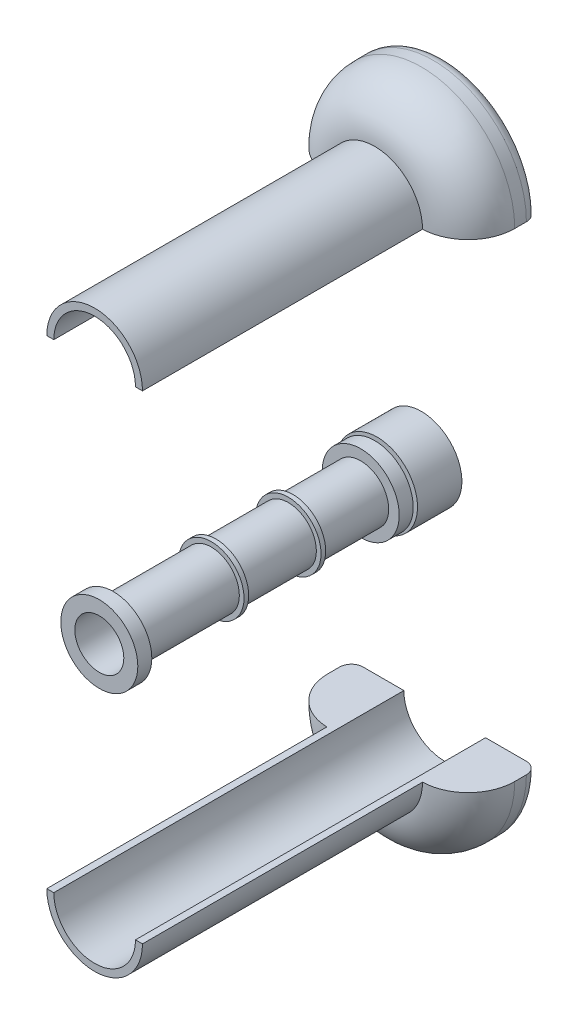
ISO-10303-21;
HEADER;
FILE_DESCRIPTION(('STEP AP214'),'2;1');
FILE_NAME('part.step','',(''),(''),'','','');
FILE_SCHEMA(('AUTOMOTIVE_DESIGN { 1 0 10303 214 1 1 1 1 }'));
ENDSEC;
DATA;
#1=APPLICATION_CONTEXT('core data for automotive mechanical design processes');
#2=APPLICATION_PROTOCOL_DEFINITION('international standard','automotive_design',2000,#1);
#3=PRODUCT_CONTEXT('',#1,'mechanical');
#4=PRODUCT('Part','Part','',(#3));
#5=PRODUCT_RELATED_PRODUCT_CATEGORY('part','',(#4));
#6=PRODUCT_DEFINITION_FORMATION('','',#4);
#7=PRODUCT_DEFINITION_CONTEXT('part definition',#1,'design');
#8=PRODUCT_DEFINITION('design','',#6,#7);
#9=PRODUCT_DEFINITION_SHAPE('','',#8);
#10=(LENGTH_UNIT() NAMED_UNIT(*) SI_UNIT(.MILLI.,.METRE.));
#11=(NAMED_UNIT(*) PLANE_ANGLE_UNIT() SI_UNIT($,.RADIAN.));
#12=(NAMED_UNIT(*) SI_UNIT($,.STERADIAN.) SOLID_ANGLE_UNIT());
#13=UNCERTAINTY_MEASURE_WITH_UNIT(LENGTH_MEASURE(1.E-05),#10,'distance_accuracy_value','');
#14=(GEOMETRIC_REPRESENTATION_CONTEXT(3) GLOBAL_UNCERTAINTY_ASSIGNED_CONTEXT((#13)) GLOBAL_UNIT_ASSIGNED_CONTEXT((#10,
#11,#12)) REPRESENTATION_CONTEXT('',''));
#15=CARTESIAN_POINT('',(0.,0.,0.));
#16=DIRECTION('',(0.,0.,1.));
#17=DIRECTION('',(1.,0.,0.));
#18=AXIS2_PLACEMENT_3D('',#15,#16,#17);
#19=CARTESIAN_POINT('',(0.,105.177811558128,0.));
#20=DIRECTION('',(0.,1.,0.));
#21=DIRECTION('',(0.,0.,1.));
#22=AXIS2_PLACEMENT_3D('',#19,#20,#21);
#23=PLANE('',#22);
#24=DIRECTION('',(0.,0.,1.));
#25=VECTOR('',#24,1.);
#26=CARTESIAN_POINT('',(17.5,105.177811558128,-35.));
#27=LINE('',#26,#25);
#28=CARTESIAN_POINT('',(17.5,105.177811558128,-30.0000000000001));
#29=VERTEX_POINT('',#28);
#30=CARTESIAN_POINT('',(17.5,105.177811558128,-1.2220184685951E-13));
#31=VERTEX_POINT('',#30);
#32=EDGE_CURVE('E117',#29,#31,#27,.T.);
#33=ORIENTED_EDGE('',*,*,#32,.F.);
#34=DIRECTION('',(1.,0.,0.));
#35=VECTOR('',#34,1.);
#36=CARTESIAN_POINT('',(-2.09488880330588E-13,105.177811558128,-30.));
#37=LINE('',#36,#35);
#38=CARTESIAN_POINT('',(34.9999999999998,105.177811558128,-30.0000000000002));
#39=VERTEX_POINT('',#38);
#40=EDGE_CURVE('E122',#29,#39,#37,.T.);
#41=ORIENTED_EDGE('',*,*,#40,.T.);
#42=CARTESIAN_POINT('',(34.9999999999998,105.177811558128,-25.0000000000002));
#43=DIRECTION('',(0.,1.,0.));
#44=DIRECTION('',(0.,0.,1.));
#45=AXIS2_PLACEMENT_3D('',#42,#43,#44);
#46=CIRCLE('',#45,5.);
#47=CARTESIAN_POINT('',(39.9999999999998,105.177811558128,-25.0000000000003));
#48=VERTEX_POINT('',#47);
#49=EDGE_CURVE('E58',#39,#48,#46,.F.);
#50=ORIENTED_EDGE('',*,*,#49,.T.);
#51=DIRECTION('',(0.,0.,1.));
#52=VECTOR('',#51,1.);
#53=CARTESIAN_POINT('',(39.9999999999998,105.177811558128,-30.0000000000003));
#54=LINE('',#53,#52);
#55=CARTESIAN_POINT('',(39.9999999999999,105.177811558128,-20.0000000000003));
#56=VERTEX_POINT('',#55);
#57=EDGE_CURVE('E72',#56,#48,#54,.F.);
#58=ORIENTED_EDGE('',*,*,#57,.F.);
#59=CARTESIAN_POINT('',(19.9999999999999,105.177811558128,-20.0000000000001));
#60=DIRECTION('',(0.,1.,0.));
#61=DIRECTION('',(0.,0.,1.));
#62=AXIS2_PLACEMENT_3D('',#59,#60,#61);
#63=CIRCLE('',#62,20.);
#64=CARTESIAN_POINT('',(20.,105.177811558128,-1.39218565815935E-13));
#65=VERTEX_POINT('',#64);
#66=EDGE_CURVE('E142',#56,#65,#63,.F.);
#67=ORIENTED_EDGE('',*,*,#66,.T.);
#68=DIRECTION('',(1.,0.,0.));
#69=VECTOR('',#68,1.);
#70=CARTESIAN_POINT('',(0.,105.177811558128,0.));
#71=LINE('',#70,#69);
#72=EDGE_CURVE('E116',#31,#65,#71,.T.);
#73=ORIENTED_EDGE('',*,*,#72,.F.);
#74=EDGE_LOOP('',(#33,#41,#50,#58,#67,#73));
#75=FACE_BOUND('',#74,.T.);
#76=ADVANCED_FACE('F49',(#75),#23,.F.);
#77=CARTESIAN_POINT('',(-20.0000000000001,105.177811558128,-19.9999999999999));
#78=DIRECTION('',(0.,1.,0.));
#79=DIRECTION('',(0.,0.,1.));
#80=AXIS2_PLACEMENT_3D('',#77,#78,#79);
#81=CIRCLE('',#80,20.);
#82=CARTESIAN_POINT('',(-20.,105.177811558128,1.39218565815935E-13));
#83=VERTEX_POINT('',#82);
#84=CARTESIAN_POINT('',(-40.0000000000001,105.177811558128,-19.9999999999997));
#85=VERTEX_POINT('',#84);
#86=EDGE_CURVE('E140',#83,#85,#81,.F.);
#87=ORIENTED_EDGE('',*,*,#86,.T.);
#88=DIRECTION('',(0.,0.,1.));
#89=VECTOR('',#88,1.);
#90=CARTESIAN_POINT('',(-40.0000000000002,105.177811558128,-29.9999999999997));
#91=LINE('',#90,#89);
#92=CARTESIAN_POINT('',(-40.0000000000002,105.177811558128,-24.9999999999997));
#93=VERTEX_POINT('',#92);
#94=EDGE_CURVE('E123',#93,#85,#91,.T.);
#95=ORIENTED_EDGE('',*,*,#94,.F.);
#96=CARTESIAN_POINT('',(-35.0000000000002,105.177811558128,-24.9999999999998));
#97=DIRECTION('',(0.,1.,0.));
#98=DIRECTION('',(0.,0.,1.));
#99=AXIS2_PLACEMENT_3D('',#96,#97,#98);
#100=CIRCLE('',#99,5.);
#101=CARTESIAN_POINT('',(-35.0000000000002,105.177811558128,-29.9999999999998));
#102=VERTEX_POINT('',#101);
#103=EDGE_CURVE('E13',#93,#102,#100,.F.);
#104=ORIENTED_EDGE('',*,*,#103,.T.);
#105=CARTESIAN_POINT('',(-17.5,105.177811558128,-29.9999999999999));
#106=VERTEX_POINT('',#105);
#107=EDGE_CURVE('E118',#102,#106,#37,.T.);
#108=ORIENTED_EDGE('',*,*,#107,.T.);
#109=DIRECTION('',(0.,0.,1.));
#110=VECTOR('',#109,1.);
#111=CARTESIAN_POINT('',(-17.5,105.177811558128,-35.));
#112=LINE('',#111,#110);
#113=CARTESIAN_POINT('',(-17.5,105.177811558128,1.2220184685951E-13));
#114=VERTEX_POINT('',#113);
#115=EDGE_CURVE('E107',#114,#106,#112,.F.);
#116=ORIENTED_EDGE('',*,*,#115,.F.);
#117=EDGE_CURVE('E53',#83,#114,#71,.T.);
#118=ORIENTED_EDGE('',*,*,#117,.F.);
#119=EDGE_LOOP('',(#87,#95,#104,#108,#116,#118));
#120=FACE_BOUND('',#119,.T.);
#121=ADVANCED_FACE('F51',(#120),#23,.F.);
#122=CARTESIAN_POINT('',(-1.74574066942157E-13,105.177811558128,-25.));
#123=DIRECTION('',(0.,0.,-1.));
#124=DIRECTION('',(-1.,0.,0.));
#125=AXIS2_PLACEMENT_3D('',#122,#123,#124);
#126=TOROIDAL_SURFACE('',#125,35.,5.);
#127=ORIENTED_EDGE('',*,*,#49,.F.);
#128=CARTESIAN_POINT('',(-2.09488880330588E-13,105.177811558128,-30.));
#129=DIRECTION('',(0.,0.,-1.));
#130=DIRECTION('',(-1.,0.,0.));
#131=AXIS2_PLACEMENT_3D('',#128,#129,#130);
#132=CIRCLE('',#131,35.);
#133=EDGE_CURVE('E135',#102,#39,#132,.T.);
#134=ORIENTED_EDGE('',*,*,#133,.F.);
#135=ORIENTED_EDGE('',*,*,#103,.F.);
#136=CARTESIAN_POINT('',(-1.74574066942157E-13,105.177811558128,-25.));
#137=DIRECTION('',(0.,0.,-1.));
#138=DIRECTION('',(-1.,0.,0.));
#139=AXIS2_PLACEMENT_3D('',#136,#137,#138);
#140=CIRCLE('',#139,40.);
#141=EDGE_CURVE('E138',#48,#93,#140,.F.);
#142=ORIENTED_EDGE('',*,*,#141,.F.);
#143=EDGE_LOOP('',(#127,#134,#135,#142));
#144=FACE_BOUND('',#143,.T.);
#145=ADVANCED_FACE('F157',(#144),#126,.T.);
#146=CARTESIAN_POINT('',(-2.09488880330588E-13,105.177811558128,-30.));
#147=DIRECTION('',(0.,0.,-1.));
#148=DIRECTION('',(-1.,0.,0.));
#149=AXIS2_PLACEMENT_3D('',#146,#147,#148);
#150=PLANE('',#149);
#151=ORIENTED_EDGE('',*,*,#107,.F.);
#152=ORIENTED_EDGE('',*,*,#133,.T.);
#153=ORIENTED_EDGE('',*,*,#40,.F.);
#154=CARTESIAN_POINT('',(0.,105.177811558128,-30.));
#155=DIRECTION('',(0.,0.,-1.));
#156=DIRECTION('',(-1.,0.,0.));
#157=AXIS2_PLACEMENT_3D('',#154,#155,#156);
#158=CIRCLE('',#157,17.5);
#159=EDGE_CURVE('E112',#106,#29,#158,.T.);
#160=ORIENTED_EDGE('',*,*,#159,.F.);
#161=EDGE_LOOP('',(#151,#152,#153,#160));
#162=FACE_BOUND('',#161,.T.);
#163=ADVANCED_FACE('F125',(#162),#150,.T.);
#164=CARTESIAN_POINT('',(-2.09488880330588E-13,105.177811558128,-30.));
#165=DIRECTION('',(0.,0.,1.));
#166=DIRECTION('',(1.,0.,0.));
#167=AXIS2_PLACEMENT_3D('',#164,#165,#166);
#168=CYLINDRICAL_SURFACE('',#167,40.);
#169=ORIENTED_EDGE('',*,*,#141,.T.);
#170=ORIENTED_EDGE('',*,*,#94,.T.);
#171=CARTESIAN_POINT('',(-1.39659253553725E-13,105.177811558128,-20.));
#172=DIRECTION('',(0.,0.,-1.));
#173=DIRECTION('',(-1.,0.,0.));
#174=AXIS2_PLACEMENT_3D('',#171,#172,#173);
#175=CIRCLE('',#174,40.);
#176=EDGE_CURVE('E128',#85,#56,#175,.T.);
#177=ORIENTED_EDGE('',*,*,#176,.T.);
#178=ORIENTED_EDGE('',*,*,#57,.T.);
#179=EDGE_LOOP('',(#169,#170,#177,#178));
#180=FACE_BOUND('',#179,.T.);
#181=ADVANCED_FACE('F156',(#180),#168,.T.);
#182=CARTESIAN_POINT('',(0.,105.177811558128,-35.));
#183=DIRECTION('',(0.,0.,1.));
#184=DIRECTION('',(1.,0.,0.));
#185=AXIS2_PLACEMENT_3D('',#182,#183,#184);
#186=CYLINDRICAL_SURFACE('',#185,17.5);
#187=CARTESIAN_POINT('',(0.,105.177811558128,0.));
#188=DIRECTION('',(0.,0.,-1.));
#189=DIRECTION('',(-1.,0.,0.));
#190=AXIS2_PLACEMENT_3D('',#187,#188,#189);
#191=CIRCLE('',#190,17.5);
#192=EDGE_CURVE('E114',#114,#31,#191,.T.);
#193=ORIENTED_EDGE('',*,*,#192,.F.);
#194=ORIENTED_EDGE('',*,*,#115,.T.);
#195=ORIENTED_EDGE('',*,*,#159,.T.);
#196=ORIENTED_EDGE('',*,*,#32,.T.);
#197=EDGE_LOOP('',(#193,#194,#195,#196));
#198=FACE_BOUND('',#197,.T.);
#199=ADVANCED_FACE('F109',(#198),#186,.F.);
#200=CARTESIAN_POINT('',(0.,105.177811558128,0.));
#201=DIRECTION('',(0.,0.,-1.));
#202=DIRECTION('',(-1.,0.,0.));
#203=AXIS2_PLACEMENT_3D('',#200,#201,#202);
#204=PLANE('',#203);
#205=CARTESIAN_POINT('',(0.,105.177811558128,0.));
#206=DIRECTION('',(0.,0.,-1.));
#207=DIRECTION('',(-1.,0.,0.));
#208=AXIS2_PLACEMENT_3D('',#205,#206,#207);
#209=CIRCLE('',#208,20.);
#210=EDGE_CURVE('E130',#65,#83,#209,.F.);
#211=ORIENTED_EDGE('',*,*,#210,.T.);
#212=ORIENTED_EDGE('',*,*,#117,.T.);
#213=ORIENTED_EDGE('',*,*,#192,.T.);
#214=ORIENTED_EDGE('',*,*,#72,.T.);
#215=EDGE_LOOP('',(#211,#212,#213,#214));
#216=FACE_BOUND('',#215,.T.);
#217=ADVANCED_FACE('F150',(#216),#204,.F.);
#218=CARTESIAN_POINT('',(-1.39659253553725E-13,105.177811558128,-20.));
#219=DIRECTION('',(0.,0.,-1.));
#220=DIRECTION('',(-1.,0.,0.));
#221=AXIS2_PLACEMENT_3D('',#218,#219,#220);
#222=DEGENERATE_TOROIDAL_SURFACE('',#221,20.,20.,.T.);
#223=ORIENTED_EDGE('',*,*,#66,.F.);
#224=ORIENTED_EDGE('',*,*,#176,.F.);
#225=ORIENTED_EDGE('',*,*,#86,.F.);
#226=ORIENTED_EDGE('',*,*,#210,.F.);
#227=EDGE_LOOP('',(#223,#224,#225,#226));
#228=FACE_BOUND('',#227,.T.);
#229=ADVANCED_FACE('F155',(#228),#222,.T.);
#230=CLOSED_SHELL('',(#76,#121,#145,#163,#181,#199,#217,#229));
#231=MANIFOLD_SOLID_BREP('B2',#230);
#232=CARTESIAN_POINT('',(0.,105.177811558128,0.));
#233=DIRECTION('',(0.,1.,0.));
#234=DIRECTION('',(0.,0.,1.));
#235=AXIS2_PLACEMENT_3D('',#232,#233,#234);
#236=PLANE('',#235);
#237=DIRECTION('',(0.,0.,1.));
#238=VECTOR('',#237,1.);
#239=CARTESIAN_POINT('',(-17.5,105.177811558128,-35.));
#240=LINE('',#239,#238);
#241=CARTESIAN_POINT('',(-17.5,105.177811558128,120.));
#242=VERTEX_POINT('',#241);
#243=CARTESIAN_POINT('',(-17.5,105.177811558128,0.));
#244=VERTEX_POINT('',#243);
#245=EDGE_CURVE('E284',#242,#244,#240,.F.);
#246=ORIENTED_EDGE('',*,*,#245,.F.);
#247=DIRECTION('',(-1.,0.,0.));
#248=VECTOR('',#247,1.);
#249=CARTESIAN_POINT('',(0.,105.177811558128,120.));
#250=LINE('',#249,#248);
#251=CARTESIAN_POINT('',(-20.5,105.177811558128,120.));
#252=VERTEX_POINT('',#251);
#253=EDGE_CURVE('E47',#242,#252,#250,.T.);
#254=ORIENTED_EDGE('',*,*,#253,.T.);
#255=DIRECTION('',(0.,0.,-1.));
#256=VECTOR('',#255,1.);
#257=CARTESIAN_POINT('',(-20.5,105.177811558128,120.));
#258=LINE('',#257,#256);
#259=CARTESIAN_POINT('',(-20.5,105.177811558128,0.));
#260=VERTEX_POINT('',#259);
#261=EDGE_CURVE('E255',#260,#252,#258,.F.);
#262=ORIENTED_EDGE('',*,*,#261,.F.);
#263=DIRECTION('',(-1.,0.,0.));
#264=VECTOR('',#263,1.);
#265=CARTESIAN_POINT('',(0.,105.177811558128,0.));
#266=LINE('',#265,#264);
#267=EDGE_CURVE('E298',#244,#260,#266,.T.);
#268=ORIENTED_EDGE('',*,*,#267,.F.);
#269=EDGE_LOOP('',(#246,#254,#262,#268));
#270=FACE_BOUND('',#269,.T.);
#271=ADVANCED_FACE('F232',(#270),#236,.F.);
#272=DIRECTION('',(0.,0.,-1.));
#273=VECTOR('',#272,1.);
#274=CARTESIAN_POINT('',(20.5,105.177811558128,120.));
#275=LINE('',#274,#273);
#276=CARTESIAN_POINT('',(20.5,105.177811558128,120.));
#277=VERTEX_POINT('',#276);
#278=CARTESIAN_POINT('',(20.5,105.177811558128,0.));
#279=VERTEX_POINT('',#278);
#280=EDGE_CURVE('E289',#277,#279,#275,.T.);
#281=ORIENTED_EDGE('',*,*,#280,.F.);
#282=CARTESIAN_POINT('',(17.5,105.177811558128,120.));
#283=VERTEX_POINT('',#282);
#284=EDGE_CURVE('E240',#277,#283,#250,.T.);
#285=ORIENTED_EDGE('',*,*,#284,.T.);
#286=DIRECTION('',(0.,0.,1.));
#287=VECTOR('',#286,1.);
#288=CARTESIAN_POINT('',(17.5,105.177811558128,-35.));
#289=LINE('',#288,#287);
#290=CARTESIAN_POINT('',(17.5,105.177811558128,0.));
#291=VERTEX_POINT('',#290);
#292=EDGE_CURVE('E277',#291,#283,#289,.T.);
#293=ORIENTED_EDGE('',*,*,#292,.F.);
#294=EDGE_CURVE('E235',#279,#291,#266,.T.);
#295=ORIENTED_EDGE('',*,*,#294,.F.);
#296=EDGE_LOOP('',(#281,#285,#293,#295));
#297=FACE_BOUND('',#296,.T.);
#298=ADVANCED_FACE('F287',(#297),#236,.F.);
#299=CARTESIAN_POINT('',(0.,105.177811558128,-35.));
#300=DIRECTION('',(0.,0.,1.));
#301=DIRECTION('',(1.,0.,0.));
#302=AXIS2_PLACEMENT_3D('',#299,#300,#301);
#303=CYLINDRICAL_SURFACE('',#302,17.5);
#304=CARTESIAN_POINT('',(0.,105.177811558128,120.));
#305=DIRECTION('',(0.,0.,1.));
#306=DIRECTION('',(1.,0.,0.));
#307=AXIS2_PLACEMENT_3D('',#304,#305,#306);
#308=CIRCLE('',#307,17.5);
#309=EDGE_CURVE('E280',#283,#242,#308,.T.);
#310=ORIENTED_EDGE('',*,*,#309,.T.);
#311=ORIENTED_EDGE('',*,*,#245,.T.);
#312=CARTESIAN_POINT('',(0.,105.177811558128,0.));
#313=DIRECTION('',(0.,0.,1.));
#314=DIRECTION('',(1.,0.,0.));
#315=AXIS2_PLACEMENT_3D('',#312,#313,#314);
#316=CIRCLE('',#315,17.5);
#317=EDGE_CURVE('E282',#291,#244,#316,.T.);
#318=ORIENTED_EDGE('',*,*,#317,.F.);
#319=ORIENTED_EDGE('',*,*,#292,.T.);
#320=EDGE_LOOP('',(#310,#311,#318,#319));
#321=FACE_BOUND('',#320,.T.);
#322=ADVANCED_FACE('F278',(#321),#303,.F.);
#323=CARTESIAN_POINT('',(0.,105.177811558128,0.));
#324=DIRECTION('',(0.,0.,1.));
#325=DIRECTION('',(1.,0.,0.));
#326=AXIS2_PLACEMENT_3D('',#323,#324,#325);
#327=PLANE('',#326);
#328=ORIENTED_EDGE('',*,*,#317,.T.);
#329=ORIENTED_EDGE('',*,*,#267,.T.);
#330=CARTESIAN_POINT('',(0.,105.177811558128,0.));
#331=DIRECTION('',(0.,0.,1.));
#332=DIRECTION('',(1.,0.,0.));
#333=AXIS2_PLACEMENT_3D('',#330,#331,#332);
#334=CIRCLE('',#333,20.5);
#335=EDGE_CURVE('E293',#279,#260,#334,.T.);
#336=ORIENTED_EDGE('',*,*,#335,.F.);
#337=ORIENTED_EDGE('',*,*,#294,.T.);
#338=EDGE_LOOP('',(#328,#329,#336,#337));
#339=FACE_BOUND('',#338,.T.);
#340=ADVANCED_FACE('F303',(#339),#327,.F.);
#341=CARTESIAN_POINT('',(0.,105.177811558128,120.));
#342=DIRECTION('',(0.,0.,1.));
#343=DIRECTION('',(1.,0.,0.));
#344=AXIS2_PLACEMENT_3D('',#341,#342,#343);
#345=PLANE('',#344);
#346=ORIENTED_EDGE('',*,*,#284,.F.);
#347=CARTESIAN_POINT('',(0.,105.177811558128,120.));
#348=DIRECTION('',(0.,0.,1.));
#349=DIRECTION('',(1.,0.,0.));
#350=AXIS2_PLACEMENT_3D('',#347,#348,#349);
#351=CIRCLE('',#350,20.5);
#352=EDGE_CURVE('E285',#277,#252,#351,.T.);
#353=ORIENTED_EDGE('',*,*,#352,.T.);
#354=ORIENTED_EDGE('',*,*,#253,.F.);
#355=ORIENTED_EDGE('',*,*,#309,.F.);
#356=EDGE_LOOP('',(#346,#353,#354,#355));
#357=FACE_BOUND('',#356,.T.);
#358=ADVANCED_FACE('F290',(#357),#345,.T.);
#359=CARTESIAN_POINT('',(0.,105.177811558128,120.));
#360=DIRECTION('',(0.,0.,-1.));
#361=DIRECTION('',(-1.,0.,0.));
#362=AXIS2_PLACEMENT_3D('',#359,#360,#361);
#363=CYLINDRICAL_SURFACE('',#362,20.5);
#364=ORIENTED_EDGE('',*,*,#352,.F.);
#365=ORIENTED_EDGE('',*,*,#280,.T.);
#366=ORIENTED_EDGE('',*,*,#335,.T.);
#367=ORIENTED_EDGE('',*,*,#261,.T.);
#368=EDGE_LOOP('',(#364,#365,#366,#367));
#369=FACE_BOUND('',#368,.T.);
#370=ADVANCED_FACE('F301',(#369),#363,.T.);
#371=CLOSED_SHELL('',(#271,#298,#322,#340,#358,#370));
#372=MANIFOLD_SOLID_BREP('B7',#371);
#373=CARTESIAN_POINT('',(0.,-100.,0.));
#374=DIRECTION('',(0.,1.,0.));
#375=DIRECTION('',(0.,0.,1.));
#376=AXIS2_PLACEMENT_3D('',#373,#374,#375);
#377=PLANE('',#376);
#378=DIRECTION('',(0.,0.,1.));
#379=VECTOR('',#378,1.);
#380=CARTESIAN_POINT('',(17.5,-100.,-35.));
#381=LINE('',#380,#379);
#382=CARTESIAN_POINT('',(17.5,-100.,-30.0000000000001));
#383=VERTEX_POINT('',#382);
#384=CARTESIAN_POINT('',(17.5,-100.,120.));
#385=VERTEX_POINT('',#384);
#386=EDGE_CURVE('E427',#383,#385,#381,.T.);
#387=ORIENTED_EDGE('',*,*,#386,.T.);
#388=DIRECTION('',(-1.,0.,0.));
#389=VECTOR('',#388,1.);
#390=CARTESIAN_POINT('',(0.,-100.,120.));
#391=LINE('',#390,#389);
#392=CARTESIAN_POINT('',(20.5,-100.,120.));
#393=VERTEX_POINT('',#392);
#394=EDGE_CURVE('E431',#393,#385,#391,.T.);
#395=ORIENTED_EDGE('',*,*,#394,.F.);
#396=DIRECTION('',(0.,0.,-1.));
#397=VECTOR('',#396,1.);
#398=CARTESIAN_POINT('',(20.5,-100.,120.));
#399=LINE('',#398,#397);
#400=CARTESIAN_POINT('',(20.5,-100.,0.));
#401=VERTEX_POINT('',#400);
#402=EDGE_CURVE('E451',#393,#401,#399,.T.);
#403=ORIENTED_EDGE('',*,*,#402,.T.);
#404=DIRECTION('',(-1.,0.,0.));
#405=VECTOR('',#404,1.);
#406=CARTESIAN_POINT('',(0.,-100.,0.));
#407=LINE('',#406,#405);
#408=CARTESIAN_POINT('',(19.9999999999999,-100.,0.));
#409=VERTEX_POINT('',#408);
#410=EDGE_CURVE('E458',#401,#409,#407,.T.);
#411=ORIENTED_EDGE('',*,*,#410,.T.);
#412=CARTESIAN_POINT('',(19.9999999999999,-100.,-20.0000000000001));
#413=DIRECTION('',(0.,1.,0.));
#414=DIRECTION('',(0.,0.,1.));
#415=AXIS2_PLACEMENT_3D('',#412,#413,#414);
#416=CIRCLE('',#415,20.);
#417=CARTESIAN_POINT('',(39.9999999999999,-100.,-20.0000000000003));
#418=VERTEX_POINT('',#417);
#419=EDGE_CURVE('E468',#418,#409,#416,.F.);
#420=ORIENTED_EDGE('',*,*,#419,.F.);
#421=DIRECTION('',(0.,0.,1.));
#422=VECTOR('',#421,1.);
#423=CARTESIAN_POINT('',(39.9999999999998,-100.,-30.0000000000003));
#424=LINE('',#423,#422);
#425=CARTESIAN_POINT('',(39.9999999999998,-100.,-25.0000000000003));
#426=VERTEX_POINT('',#425);
#427=EDGE_CURVE('E474',#418,#426,#424,.F.);
#428=ORIENTED_EDGE('',*,*,#427,.T.);
#429=CARTESIAN_POINT('',(34.9999999999998,-100.,-25.0000000000002));
#430=DIRECTION('',(0.,1.,0.));
#431=DIRECTION('',(0.,0.,1.));
#432=AXIS2_PLACEMENT_3D('',#429,#430,#431);
#433=CIRCLE('',#432,5.);
#434=CARTESIAN_POINT('',(34.9999999999998,-100.,-30.0000000000002));
#435=VERTEX_POINT('',#434);
#436=EDGE_CURVE('E384',#435,#426,#433,.F.);
#437=ORIENTED_EDGE('',*,*,#436,.F.);
#438=DIRECTION('',(1.,0.,0.));
#439=VECTOR('',#438,1.);
#440=CARTESIAN_POINT('',(-2.09488880330588E-13,-100.,-30.));
#441=LINE('',#440,#439);
#442=EDGE_CURVE('E434',#383,#435,#441,.T.);
#443=ORIENTED_EDGE('',*,*,#442,.F.);
#444=EDGE_LOOP('',(#387,#395,#403,#411,#420,#428,#437,#443));
#445=FACE_BOUND('',#444,.T.);
#446=ADVANCED_FACE('F361',(#445),#377,.T.);
#447=CARTESIAN_POINT('',(-20.0000000000001,-100.,-19.9999999999999));
#448=DIRECTION('',(0.,1.,0.));
#449=DIRECTION('',(0.,0.,1.));
#450=AXIS2_PLACEMENT_3D('',#447,#448,#449);
#451=CIRCLE('',#450,20.);
#452=CARTESIAN_POINT('',(-20.,-100.,1.39218565815935E-13));
#453=VERTEX_POINT('',#452);
#454=CARTESIAN_POINT('',(-40.0000000000001,-100.,-19.9999999999997));
#455=VERTEX_POINT('',#454);
#456=EDGE_CURVE('E466',#453,#455,#451,.F.);
#457=ORIENTED_EDGE('',*,*,#456,.F.);
#458=CARTESIAN_POINT('',(-20.5,-100.,0.));
#459=VERTEX_POINT('',#458);
#460=EDGE_CURVE('E459',#453,#459,#407,.T.);
#461=ORIENTED_EDGE('',*,*,#460,.T.);
#462=DIRECTION('',(0.,0.,-1.));
#463=VECTOR('',#462,1.);
#464=CARTESIAN_POINT('',(-20.5,-100.,120.));
#465=LINE('',#464,#463);
#466=CARTESIAN_POINT('',(-20.5,-100.,120.));
#467=VERTEX_POINT('',#466);
#468=EDGE_CURVE('E453',#459,#467,#465,.F.);
#469=ORIENTED_EDGE('',*,*,#468,.T.);
#470=CARTESIAN_POINT('',(-17.5,-100.,120.));
#471=VERTEX_POINT('',#470);
#472=EDGE_CURVE('E450',#471,#467,#391,.T.);
#473=ORIENTED_EDGE('',*,*,#472,.F.);
#474=DIRECTION('',(0.,0.,1.));
#475=VECTOR('',#474,1.);
#476=CARTESIAN_POINT('',(-17.5,-100.,-35.));
#477=LINE('',#476,#475);
#478=CARTESIAN_POINT('',(-17.5,-100.,-29.9999999999999));
#479=VERTEX_POINT('',#478);
#480=EDGE_CURVE('E436',#471,#479,#477,.F.);
#481=ORIENTED_EDGE('',*,*,#480,.T.);
#482=CARTESIAN_POINT('',(-35.0000000000002,-100.,-29.9999999999998));
#483=VERTEX_POINT('',#482);
#484=EDGE_CURVE('E471',#483,#479,#441,.T.);
#485=ORIENTED_EDGE('',*,*,#484,.F.);
#486=CARTESIAN_POINT('',(-35.0000000000002,-100.,-24.9999999999998));
#487=DIRECTION('',(0.,1.,0.));
#488=DIRECTION('',(0.,0.,1.));
#489=AXIS2_PLACEMENT_3D('',#486,#487,#488);
#490=CIRCLE('',#489,5.);
#491=CARTESIAN_POINT('',(-40.0000000000002,-100.,-24.9999999999997));
#492=VERTEX_POINT('',#491);
#493=EDGE_CURVE('E376',#492,#483,#490,.F.);
#494=ORIENTED_EDGE('',*,*,#493,.F.);
#495=DIRECTION('',(0.,0.,1.));
#496=VECTOR('',#495,1.);
#497=CARTESIAN_POINT('',(-40.0000000000002,-100.,-29.9999999999997));
#498=LINE('',#497,#496);
#499=EDGE_CURVE('E472',#492,#455,#498,.T.);
#500=ORIENTED_EDGE('',*,*,#499,.T.);
#501=EDGE_LOOP('',(#457,#461,#469,#473,#481,#485,#494,#500));
#502=FACE_BOUND('',#501,.T.);
#503=ADVANCED_FACE('F492',(#502),#377,.T.);
#504=CARTESIAN_POINT('',(-1.74574066942157E-13,-100.,-25.));
#505=DIRECTION('',(0.,0.,-1.));
#506=DIRECTION('',(-1.,0.,0.));
#507=AXIS2_PLACEMENT_3D('',#504,#505,#506);
#508=TOROIDAL_SURFACE('',#507,35.,5.);
#509=CARTESIAN_POINT('',(-2.09488880330588E-13,-100.,-30.));
#510=DIRECTION('',(0.,0.,-1.));
#511=DIRECTION('',(-1.,0.,0.));
#512=AXIS2_PLACEMENT_3D('',#509,#510,#511);
#513=CIRCLE('',#512,35.);
#514=EDGE_CURVE('E479',#435,#483,#513,.T.);
#515=ORIENTED_EDGE('',*,*,#514,.F.);
#516=ORIENTED_EDGE('',*,*,#436,.T.);
#517=CARTESIAN_POINT('',(-1.74574066942157E-13,-100.,-25.));
#518=DIRECTION('',(0.,0.,-1.));
#519=DIRECTION('',(-1.,0.,0.));
#520=AXIS2_PLACEMENT_3D('',#517,#518,#519);
#521=CIRCLE('',#520,40.);
#522=EDGE_CURVE('E464',#492,#426,#521,.F.);
#523=ORIENTED_EDGE('',*,*,#522,.F.);
#524=ORIENTED_EDGE('',*,*,#493,.T.);
#525=EDGE_LOOP('',(#515,#516,#523,#524));
#526=FACE_BOUND('',#525,.T.);
#527=ADVANCED_FACE('F494',(#526),#508,.T.);
#528=CARTESIAN_POINT('',(-2.09488880330588E-13,-100.,-30.));
#529=DIRECTION('',(0.,0.,-1.));
#530=DIRECTION('',(-1.,0.,0.));
#531=AXIS2_PLACEMENT_3D('',#528,#529,#530);
#532=PLANE('',#531);
#533=ORIENTED_EDGE('',*,*,#514,.T.);
#534=ORIENTED_EDGE('',*,*,#484,.T.);
#535=CARTESIAN_POINT('',(0.,-100.,-30.));
#536=DIRECTION('',(0.,0.,-1.));
#537=DIRECTION('',(-1.,0.,0.));
#538=AXIS2_PLACEMENT_3D('',#535,#536,#537);
#539=CIRCLE('',#538,17.5);
#540=EDGE_CURVE('E230',#383,#479,#539,.T.);
#541=ORIENTED_EDGE('',*,*,#540,.F.);
#542=ORIENTED_EDGE('',*,*,#442,.T.);
#543=EDGE_LOOP('',(#533,#534,#541,#542));
#544=FACE_BOUND('',#543,.T.);
#545=ADVANCED_FACE('F500',(#544),#532,.T.);
#546=CARTESIAN_POINT('',(-2.09488880330588E-13,-100.,-30.));
#547=DIRECTION('',(0.,0.,1.));
#548=DIRECTION('',(1.,0.,0.));
#549=AXIS2_PLACEMENT_3D('',#546,#547,#548);
#550=CYLINDRICAL_SURFACE('',#549,40.);
#551=ORIENTED_EDGE('',*,*,#499,.F.);
#552=ORIENTED_EDGE('',*,*,#522,.T.);
#553=ORIENTED_EDGE('',*,*,#427,.F.);
#554=CARTESIAN_POINT('',(-1.39659253553725E-13,-100.,-20.));
#555=DIRECTION('',(0.,0.,-1.));
#556=DIRECTION('',(-1.,0.,0.));
#557=AXIS2_PLACEMENT_3D('',#554,#555,#556);
#558=CIRCLE('',#557,40.);
#559=EDGE_CURVE('E369',#418,#455,#558,.T.);
#560=ORIENTED_EDGE('',*,*,#559,.T.);
#561=EDGE_LOOP('',(#551,#552,#553,#560));
#562=FACE_BOUND('',#561,.T.);
#563=ADVANCED_FACE('F488',(#562),#550,.T.);
#564=CARTESIAN_POINT('',(0.,-100.,-35.));
#565=DIRECTION('',(0.,0.,1.));
#566=DIRECTION('',(1.,0.,0.));
#567=AXIS2_PLACEMENT_3D('',#564,#565,#566);
#568=CYLINDRICAL_SURFACE('',#567,17.5);
#569=ORIENTED_EDGE('',*,*,#480,.F.);
#570=CARTESIAN_POINT('',(0.,-100.,120.));
#571=DIRECTION('',(0.,0.,1.));
#572=DIRECTION('',(1.,0.,0.));
#573=AXIS2_PLACEMENT_3D('',#570,#571,#572);
#574=CIRCLE('',#573,17.5);
#575=EDGE_CURVE('E437',#471,#385,#574,.T.);
#576=ORIENTED_EDGE('',*,*,#575,.T.);
#577=ORIENTED_EDGE('',*,*,#386,.F.);
#578=ORIENTED_EDGE('',*,*,#540,.T.);
#579=EDGE_LOOP('',(#569,#576,#577,#578));
#580=FACE_BOUND('',#579,.T.);
#581=ADVANCED_FACE('F440',(#580),#568,.F.);
#582=CARTESIAN_POINT('',(-1.39659253553725E-13,-100.,-20.));
#583=DIRECTION('',(0.,0.,-1.));
#584=DIRECTION('',(-1.,0.,0.));
#585=AXIS2_PLACEMENT_3D('',#582,#583,#584);
#586=DEGENERATE_TOROIDAL_SURFACE('',#585,20.,20.,.T.);
#587=ORIENTED_EDGE('',*,*,#559,.F.);
#588=ORIENTED_EDGE('',*,*,#419,.T.);
#589=CARTESIAN_POINT('',(0.,-100.,0.));
#590=DIRECTION('',(0.,0.,-1.));
#591=DIRECTION('',(-1.,0.,0.));
#592=AXIS2_PLACEMENT_3D('',#589,#590,#591);
#593=CIRCLE('',#592,20.);
#594=EDGE_CURVE('E482',#453,#409,#593,.F.);
#595=ORIENTED_EDGE('',*,*,#594,.F.);
#596=ORIENTED_EDGE('',*,*,#456,.T.);
#597=EDGE_LOOP('',(#587,#588,#595,#596));
#598=FACE_BOUND('',#597,.T.);
#599=ADVANCED_FACE('F363',(#598),#586,.T.);
#600=CARTESIAN_POINT('',(0.,-100.,0.));
#601=DIRECTION('',(0.,0.,1.));
#602=DIRECTION('',(1.,0.,0.));
#603=AXIS2_PLACEMENT_3D('',#600,#601,#602);
#604=PLANE('',#603);
#605=ORIENTED_EDGE('',*,*,#460,.F.);
#606=ORIENTED_EDGE('',*,*,#594,.T.);
#607=ORIENTED_EDGE('',*,*,#410,.F.);
#608=CARTESIAN_POINT('',(0.,-100.,0.));
#609=DIRECTION('',(0.,0.,1.));
#610=DIRECTION('',(1.,0.,0.));
#611=AXIS2_PLACEMENT_3D('',#608,#609,#610);
#612=CIRCLE('',#611,20.5);
#613=EDGE_CURVE('E444',#459,#401,#612,.T.);
#614=ORIENTED_EDGE('',*,*,#613,.F.);
#615=EDGE_LOOP('',(#605,#606,#607,#614));
#616=FACE_BOUND('',#615,.T.);
#617=ADVANCED_FACE('F502',(#616),#604,.F.);
#618=CARTESIAN_POINT('',(0.,-100.,120.));
#619=DIRECTION('',(0.,0.,1.));
#620=DIRECTION('',(1.,0.,0.));
#621=AXIS2_PLACEMENT_3D('',#618,#619,#620);
#622=PLANE('',#621);
#623=CARTESIAN_POINT('',(0.,-100.,120.));
#624=DIRECTION('',(0.,0.,1.));
#625=DIRECTION('',(1.,0.,0.));
#626=AXIS2_PLACEMENT_3D('',#623,#624,#625);
#627=CIRCLE('',#626,20.5);
#628=EDGE_CURVE('E449',#467,#393,#627,.T.);
#629=ORIENTED_EDGE('',*,*,#628,.T.);
#630=ORIENTED_EDGE('',*,*,#394,.T.);
#631=ORIENTED_EDGE('',*,*,#575,.F.);
#632=ORIENTED_EDGE('',*,*,#472,.T.);
#633=EDGE_LOOP('',(#629,#630,#631,#632));
#634=FACE_BOUND('',#633,.T.);
#635=ADVANCED_FACE('F447',(#634),#622,.T.);
#636=CARTESIAN_POINT('',(0.,-100.,120.));
#637=DIRECTION('',(0.,0.,-1.));
#638=DIRECTION('',(-1.,0.,0.));
#639=AXIS2_PLACEMENT_3D('',#636,#637,#638);
#640=CYLINDRICAL_SURFACE('',#639,20.5);
#641=ORIENTED_EDGE('',*,*,#402,.F.);
#642=ORIENTED_EDGE('',*,*,#628,.F.);
#643=ORIENTED_EDGE('',*,*,#468,.F.);
#644=ORIENTED_EDGE('',*,*,#613,.T.);
#645=EDGE_LOOP('',(#641,#642,#643,#644));
#646=FACE_BOUND('',#645,.T.);
#647=ADVANCED_FACE('F534',(#646),#640,.T.);
#648=CLOSED_SHELL('',(#446,#503,#527,#545,#563,#581,#599,#617,#635,#647));
#649=MANIFOLD_SOLID_BREP('B41',#648);
#650=CARTESIAN_POINT('',(0.,0.,0.));
#651=DIRECTION('',(0.,0.,-1.));
#652=DIRECTION('',(-1.,0.,0.));
#653=AXIS2_PLACEMENT_3D('',#650,#651,#652);
#654=CYLINDRICAL_SURFACE('',#653,2.5);
#655=CARTESIAN_POINT('',(0.,0.,-0.999999999999954));
#656=DIRECTION('',(0.,0.,-1.));
#657=DIRECTION('',(-1.,0.,0.));
#658=AXIS2_PLACEMENT_3D('',#655,#656,#657);
#659=CIRCLE('',#658,2.5);
#660=CARTESIAN_POINT('',(-2.50000000000001,0.,-0.999999999999936));
#661=VERTEX_POINT('',#660);
#662=EDGE_CURVE('E614',#661,#661,#659,.T.);
#663=ORIENTED_EDGE('',*,*,#662,.F.);
#664=EDGE_LOOP('',(#663));
#665=FACE_BOUND('',#664,.T.);
#666=CARTESIAN_POINT('',(0.,0.,-2.99999999999996));
#667=DIRECTION('',(0.,0.,-1.));
#668=DIRECTION('',(-1.,0.,0.));
#669=AXIS2_PLACEMENT_3D('',#666,#667,#668);
#670=CIRCLE('',#669,2.5);
#671=CARTESIAN_POINT('',(-2.50000000000002,0.,-2.99999999999994));
#672=VERTEX_POINT('',#671);
#673=EDGE_CURVE('E620',#672,#672,#670,.F.);
#674=ORIENTED_EDGE('',*,*,#673,.F.);
#675=EDGE_LOOP('',(#674));
#676=FACE_BOUND('',#675,.T.);
#677=ADVANCED_FACE('F601',(#665,#676),#654,.F.);
#678=CARTESIAN_POINT('',(-3.84062947272745E-13,0.,-20.));
#679=DIRECTION('',(0.,0.,1.));
#680=DIRECTION('',(1.,0.,0.));
#681=AXIS2_PLACEMENT_3D('',#678,#679,#680);
#682=CYLINDRICAL_SURFACE('',#681,17.3459245682489);
#683=CARTESIAN_POINT('',(-3.84062947272745E-13,0.,-20.));
#684=DIRECTION('',(0.,0.,-1.));
#685=DIRECTION('',(-1.,0.,0.));
#686=AXIS2_PLACEMENT_3D('',#683,#684,#685);
#687=CIRCLE('',#686,17.3459245682489);
#688=CARTESIAN_POINT('',(-17.3459245682492,0.,-19.9999999999999));
#689=VERTEX_POINT('',#688);
#690=EDGE_CURVE('E360',#689,#689,#687,.T.);
#691=ORIENTED_EDGE('',*,*,#690,.F.);
#692=EDGE_LOOP('',(#691));
#693=FACE_BOUND('',#692,.T.);
#694=CARTESIAN_POINT('',(-2.51386656396705E-13,0.,-0.999999999999954));
#695=DIRECTION('',(0.,0.,-1.));
#696=DIRECTION('',(-1.,0.,0.));
#697=AXIS2_PLACEMENT_3D('',#694,#695,#696);
#698=CIRCLE('',#697,17.3459245682489);
#699=CARTESIAN_POINT('',(-17.3459245682491,0.,-0.999999999999833));
#700=VERTEX_POINT('',#699);
#701=EDGE_CURVE('E609',#700,#700,#698,.T.);
#702=ORIENTED_EDGE('',*,*,#701,.T.);
#703=EDGE_LOOP('',(#702));
#704=FACE_BOUND('',#703,.T.);
#705=ADVANCED_FACE('F603',(#693,#704),#682,.T.);
#706=CARTESIAN_POINT('',(-3.84062947272745E-13,0.,-20.));
#707=DIRECTION('',(0.,0.,-1.));
#708=DIRECTION('',(-1.,0.,0.));
#709=AXIS2_PLACEMENT_3D('',#706,#707,#708);
#710=PLANE('',#709);
#711=CARTESIAN_POINT('',(-1.39659253553725E-13,0.,-20.));
#712=DIRECTION('',(0.,0.,-1.));
#713=DIRECTION('',(-1.,0.,0.));
#714=AXIS2_PLACEMENT_3D('',#711,#712,#713);
#715=CIRCLE('',#714,2.5);
#716=CARTESIAN_POINT('',(-2.50000000000014,0.,-20.));
#717=VERTEX_POINT('',#716);
#718=EDGE_CURVE('E619',#717,#717,#715,.T.);
#719=ORIENTED_EDGE('',*,*,#718,.F.);
#720=EDGE_LOOP('',(#719));
#721=FACE_BOUND('',#720,.T.);
#722=ORIENTED_EDGE('',*,*,#690,.T.);
#723=EDGE_LOOP('',(#722));
#724=FACE_BOUND('',#723,.T.);
#725=ADVANCED_FACE('F638',(#721,#724),#710,.T.);
#726=CARTESIAN_POINT('',(-2.51386656396705E-13,0.,-0.999999999999954));
#727=DIRECTION('',(0.,0.,-1.));
#728=DIRECTION('',(-1.,0.,0.));
#729=AXIS2_PLACEMENT_3D('',#726,#727,#728);
#730=PLANE('',#729);
#731=ORIENTED_EDGE('',*,*,#662,.T.);
#732=EDGE_LOOP('',(#731));
#733=FACE_BOUND('',#732,.T.);
#734=ORIENTED_EDGE('',*,*,#701,.F.);
#735=EDGE_LOOP('',(#734));
#736=FACE_BOUND('',#735,.T.);
#737=ADVANCED_FACE('F640',(#733,#736),#730,.F.);
#738=CARTESIAN_POINT('',(-1.25693328198353E-13,0.,-18.));
#739=DIRECTION('',(0.,0.,-1.));
#740=DIRECTION('',(-1.,0.,0.));
#741=AXIS2_PLACEMENT_3D('',#738,#739,#740);
#742=CIRCLE('',#741,2.5);
#743=CARTESIAN_POINT('',(-2.50000000000013,0.,-18.));
#744=VERTEX_POINT('',#743);
#745=EDGE_CURVE('E605',#744,#744,#742,.F.);
#746=ORIENTED_EDGE('',*,*,#745,.T.);
#747=EDGE_LOOP('',(#746));
#748=FACE_BOUND('',#747,.T.);
#749=ORIENTED_EDGE('',*,*,#718,.T.);
#750=EDGE_LOOP('',(#749));
#751=FACE_BOUND('',#750,.T.);
#752=ADVANCED_FACE('F636',(#748,#751),#654,.F.);
#753=CARTESIAN_POINT('',(-3.70097021917372E-13,0.,-18.));
#754=DIRECTION('',(0.,0.,-1.));
#755=DIRECTION('',(-1.,0.,0.));
#756=AXIS2_PLACEMENT_3D('',#753,#754,#755);
#757=PLANE('',#756);
#758=CARTESIAN_POINT('',(-3.70097021917372E-13,0.,-18.));
#759=DIRECTION('',(0.,0.,-1.));
#760=DIRECTION('',(-1.,0.,0.));
#761=AXIS2_PLACEMENT_3D('',#758,#759,#760);
#762=CIRCLE('',#761,15.);
#763=CARTESIAN_POINT('',(-15.0000000000004,0.,-17.9999999999999));
#764=VERTEX_POINT('',#763);
#765=EDGE_CURVE('E622',#764,#764,#762,.T.);
#766=ORIENTED_EDGE('',*,*,#765,.F.);
#767=EDGE_LOOP('',(#766));
#768=FACE_BOUND('',#767,.T.);
#769=ORIENTED_EDGE('',*,*,#745,.F.);
#770=EDGE_LOOP('',(#769));
#771=FACE_BOUND('',#770,.T.);
#772=ADVANCED_FACE('F657',(#768,#771),#757,.F.);
#773=CARTESIAN_POINT('',(-2.65352581752078E-13,0.,-2.99999999999996));
#774=DIRECTION('',(0.,0.,-1.));
#775=DIRECTION('',(-1.,0.,0.));
#776=AXIS2_PLACEMENT_3D('',#773,#774,#775);
#777=PLANE('',#776);
#778=CARTESIAN_POINT('',(-2.65352581752078E-13,0.,-2.99999999999996));
#779=DIRECTION('',(0.,0.,-1.));
#780=DIRECTION('',(-1.,0.,0.));
#781=AXIS2_PLACEMENT_3D('',#778,#779,#780);
#782=CIRCLE('',#781,15.);
#783=CARTESIAN_POINT('',(-15.0000000000003,0.,-2.99999999999986));
#784=VERTEX_POINT('',#783);
#785=EDGE_CURVE('E627',#784,#784,#782,.T.);
#786=ORIENTED_EDGE('',*,*,#785,.T.);
#787=EDGE_LOOP('',(#786));
#788=FACE_BOUND('',#787,.T.);
#789=ORIENTED_EDGE('',*,*,#673,.T.);
#790=EDGE_LOOP('',(#789));
#791=FACE_BOUND('',#790,.T.);
#792=ADVANCED_FACE('F662',(#788,#791),#777,.T.);
#793=CARTESIAN_POINT('',(-3.70097021917372E-13,0.,-18.));
#794=DIRECTION('',(0.,0.,1.));
#795=DIRECTION('',(1.,0.,0.));
#796=AXIS2_PLACEMENT_3D('',#793,#794,#795);
#797=CYLINDRICAL_SURFACE('',#796,15.);
#798=ORIENTED_EDGE('',*,*,#765,.T.);
#799=EDGE_LOOP('',(#798));
#800=FACE_BOUND('',#799,.T.);
#801=ORIENTED_EDGE('',*,*,#785,.F.);
#802=EDGE_LOOP('',(#801));
#803=FACE_BOUND('',#802,.T.);
#804=ADVANCED_FACE('F670',(#800,#803),#797,.F.);
#805=CLOSED_SHELL('',(#677,#705,#725,#737,#752,#772,#792,#804));
#806=MANIFOLD_SOLID_BREP('B224',#805);
#807=CARTESIAN_POINT('',(0.,0.,118.));
#808=DIRECTION('',(0.,0.,-1.));
#809=DIRECTION('',(-1.,0.,0.));
#810=AXIS2_PLACEMENT_3D('',#807,#808,#809);
#811=CYLINDRICAL_SURFACE('',#810,12.);
#812=CARTESIAN_POINT('',(0.,0.,70.));
#813=DIRECTION('',(0.,0.,1.));
#814=DIRECTION('',(1.,0.,0.));
#815=AXIS2_PLACEMENT_3D('',#812,#813,#814);
#816=CIRCLE('',#815,12.);
#817=CARTESIAN_POINT('',(12.,0.,70.));
#818=VERTEX_POINT('',#817);
#819=EDGE_CURVE('E735',#818,#818,#816,.T.);
#820=ORIENTED_EDGE('',*,*,#819,.T.);
#821=EDGE_LOOP('',(#820));
#822=FACE_BOUND('',#821,.T.);
#823=CARTESIAN_POINT('',(0.,0.,112.));
#824=DIRECTION('',(0.,0.,1.));
#825=DIRECTION('',(1.,0.,0.));
#826=AXIS2_PLACEMENT_3D('',#823,#824,#825);
#827=CIRCLE('',#826,12.);
#828=CARTESIAN_POINT('',(12.,0.,112.));
#829=VERTEX_POINT('',#828);
#830=EDGE_CURVE('E739',#829,#829,#827,.F.);
#831=ORIENTED_EDGE('',*,*,#830,.T.);
#832=EDGE_LOOP('',(#831));
#833=FACE_BOUND('',#832,.T.);
#834=ADVANCED_FACE('F722',(#822,#833),#811,.T.);
#835=CARTESIAN_POINT('',(0.,0.,37.));
#836=DIRECTION('',(0.,0.,-1.));
#837=DIRECTION('',(-1.,0.,0.));
#838=AXIS2_PLACEMENT_3D('',#835,#836,#837);
#839=CYLINDRICAL_SURFACE('',#838,14.);
#840=CARTESIAN_POINT('',(0.,0.,37.));
#841=DIRECTION('',(0.,0.,1.));
#842=DIRECTION('',(1.,0.,0.));
#843=AXIS2_PLACEMENT_3D('',#840,#841,#842);
#844=CIRCLE('',#843,14.);
#845=CARTESIAN_POINT('',(14.,0.,37.));
#846=VERTEX_POINT('',#845);
#847=EDGE_CURVE('E773',#846,#846,#844,.T.);
#848=ORIENTED_EDGE('',*,*,#847,.F.);
#849=EDGE_LOOP('',(#848));
#850=FACE_BOUND('',#849,.T.);
#851=CARTESIAN_POINT('',(0.,0.,35.));
#852=DIRECTION('',(0.,0.,1.));
#853=DIRECTION('',(1.,0.,0.));
#854=AXIS2_PLACEMENT_3D('',#851,#852,#853);
#855=CIRCLE('',#854,14.);
#856=CARTESIAN_POINT('',(14.,0.,35.));
#857=VERTEX_POINT('',#856);
#858=EDGE_CURVE('E770',#857,#857,#855,.T.);
#859=ORIENTED_EDGE('',*,*,#858,.T.);
#860=EDGE_LOOP('',(#859));
#861=FACE_BOUND('',#860,.T.);
#862=ADVANCED_FACE('F778',(#850,#861),#839,.T.);
#863=CARTESIAN_POINT('',(0.,0.,37.));
#864=DIRECTION('',(0.,0.,1.));
#865=DIRECTION('',(1.,0.,0.));
#866=AXIS2_PLACEMENT_3D('',#863,#864,#865);
#867=PLANE('',#866);
#868=CARTESIAN_POINT('',(0.,0.,37.));
#869=DIRECTION('',(0.,0.,1.));
#870=DIRECTION('',(1.,0.,0.));
#871=AXIS2_PLACEMENT_3D('',#868,#869,#870);
#872=CIRCLE('',#871,12.);
#873=CARTESIAN_POINT('',(12.,0.,37.));
#874=VERTEX_POINT('',#873);
#875=EDGE_CURVE('E730',#874,#874,#872,.T.);
#876=ORIENTED_EDGE('',*,*,#875,.F.);
#877=EDGE_LOOP('',(#876));
#878=FACE_BOUND('',#877,.T.);
#879=ORIENTED_EDGE('',*,*,#847,.T.);
#880=EDGE_LOOP('',(#879));
#881=FACE_BOUND('',#880,.T.);
#882=ADVANCED_FACE('F783',(#878,#881),#867,.T.);
#883=CARTESIAN_POINT('',(0.,0.,35.));
#884=DIRECTION('',(0.,0.,1.));
#885=DIRECTION('',(1.,0.,0.));
#886=AXIS2_PLACEMENT_3D('',#883,#884,#885);
#887=PLANE('',#886);
#888=CARTESIAN_POINT('',(0.,0.,35.));
#889=DIRECTION('',(0.,0.,1.));
#890=DIRECTION('',(1.,0.,0.));
#891=AXIS2_PLACEMENT_3D('',#888,#889,#890);
#892=CIRCLE('',#891,12.);
#893=CARTESIAN_POINT('',(12.,0.,35.));
#894=VERTEX_POINT('',#893);
#895=EDGE_CURVE('E763',#894,#894,#892,.T.);
#896=ORIENTED_EDGE('',*,*,#895,.T.);
#897=EDGE_LOOP('',(#896));
#898=FACE_BOUND('',#897,.T.);
#899=ORIENTED_EDGE('',*,*,#858,.F.);
#900=EDGE_LOOP('',(#899));
#901=FACE_BOUND('',#900,.T.);
#902=ADVANCED_FACE('F780',(#898,#901),#887,.F.);
#903=ORIENTED_EDGE('',*,*,#875,.T.);
#904=EDGE_LOOP('',(#903));
#905=FACE_BOUND('',#904,.T.);
#906=CARTESIAN_POINT('',(0.,0.,68.));
#907=DIRECTION('',(0.,0.,1.));
#908=DIRECTION('',(1.,0.,0.));
#909=AXIS2_PLACEMENT_3D('',#906,#907,#908);
#910=CIRCLE('',#909,12.);
#911=CARTESIAN_POINT('',(12.,0.,68.));
#912=VERTEX_POINT('',#911);
#913=EDGE_CURVE('E759',#912,#912,#910,.T.);
#914=ORIENTED_EDGE('',*,*,#913,.F.);
#915=EDGE_LOOP('',(#914));
#916=FACE_BOUND('',#915,.T.);
#917=ADVANCED_FACE('F782',(#905,#916),#811,.T.);
#918=CARTESIAN_POINT('',(0.,0.,6.00000000000003));
#919=DIRECTION('',(0.,0.,1.));
#920=DIRECTION('',(1.,0.,0.));
#921=AXIS2_PLACEMENT_3D('',#918,#919,#920);
#922=CIRCLE('',#921,12.);
#923=CARTESIAN_POINT('',(12.,0.,6.00000000000003));
#924=VERTEX_POINT('',#923);
#925=EDGE_CURVE('E600',#924,#924,#922,.F.);
#926=ORIENTED_EDGE('',*,*,#925,.F.);
#927=EDGE_LOOP('',(#926));
#928=FACE_BOUND('',#927,.T.);
#929=ORIENTED_EDGE('',*,*,#895,.F.);
#930=EDGE_LOOP('',(#929));
#931=FACE_BOUND('',#930,.T.);
#932=ADVANCED_FACE('F790',(#928,#931),#811,.T.);
#933=CARTESIAN_POINT('',(0.,0.,68.));
#934=DIRECTION('',(0.,0.,1.));
#935=DIRECTION('',(1.,0.,0.));
#936=AXIS2_PLACEMENT_3D('',#933,#934,#935);
#937=PLANE('',#936);
#938=ORIENTED_EDGE('',*,*,#913,.T.);
#939=EDGE_LOOP('',(#938));
#940=FACE_BOUND('',#939,.T.);
#941=CARTESIAN_POINT('',(0.,0.,68.));
#942=DIRECTION('',(0.,0.,1.));
#943=DIRECTION('',(1.,0.,0.));
#944=AXIS2_PLACEMENT_3D('',#941,#942,#943);
#945=CIRCLE('',#944,14.);
#946=CARTESIAN_POINT('',(14.,0.,68.));
#947=VERTEX_POINT('',#946);
#948=EDGE_CURVE('E767',#947,#947,#945,.T.);
#949=ORIENTED_EDGE('',*,*,#948,.F.);
#950=EDGE_LOOP('',(#949));
#951=FACE_BOUND('',#950,.T.);
#952=ADVANCED_FACE('F806',(#940,#951),#937,.F.);
#953=CARTESIAN_POINT('',(0.,0.,68.));
#954=DIRECTION('',(0.,0.,1.));
#955=DIRECTION('',(1.,0.,0.));
#956=AXIS2_PLACEMENT_3D('',#953,#954,#955);
#957=CYLINDRICAL_SURFACE('',#956,14.);
#958=ORIENTED_EDGE('',*,*,#948,.T.);
#959=EDGE_LOOP('',(#958));
#960=FACE_BOUND('',#959,.T.);
#961=CARTESIAN_POINT('',(0.,0.,70.));
#962=DIRECTION('',(0.,0.,1.));
#963=DIRECTION('',(1.,0.,0.));
#964=AXIS2_PLACEMENT_3D('',#961,#962,#963);
#965=CIRCLE('',#964,14.);
#966=CARTESIAN_POINT('',(14.,0.,70.));
#967=VERTEX_POINT('',#966);
#968=EDGE_CURVE('E765',#967,#967,#965,.T.);
#969=ORIENTED_EDGE('',*,*,#968,.F.);
#970=EDGE_LOOP('',(#969));
#971=FACE_BOUND('',#970,.T.);
#972=ADVANCED_FACE('F811',(#960,#971),#957,.T.);
#973=CARTESIAN_POINT('',(0.,0.,70.));
#974=DIRECTION('',(0.,0.,1.));
#975=DIRECTION('',(1.,0.,0.));
#976=AXIS2_PLACEMENT_3D('',#973,#974,#975);
#977=PLANE('',#976);
#978=ORIENTED_EDGE('',*,*,#819,.F.);
#979=EDGE_LOOP('',(#978));
#980=FACE_BOUND('',#979,.T.);
#981=ORIENTED_EDGE('',*,*,#968,.T.);
#982=EDGE_LOOP('',(#981));
#983=FACE_BOUND('',#982,.T.);
#984=ADVANCED_FACE('F818',(#980,#983),#977,.T.);
#985=CARTESIAN_POINT('',(0.,0.,6.00000000000003));
#986=DIRECTION('',(0.,0.,-1.));
#987=DIRECTION('',(-1.,0.,0.));
#988=AXIS2_PLACEMENT_3D('',#985,#986,#987);
#989=CYLINDRICAL_SURFACE('',#988,16.5);
#990=CARTESIAN_POINT('',(0.,0.,6.00000000000003));
#991=DIRECTION('',(0.,0.,1.));
#992=DIRECTION('',(1.,0.,0.));
#993=AXIS2_PLACEMENT_3D('',#990,#991,#992);
#994=CIRCLE('',#993,16.5);
#995=CARTESIAN_POINT('',(16.5,0.,6.00000000000003));
#996=VERTEX_POINT('',#995);
#997=EDGE_CURVE('E746',#996,#996,#994,.T.);
#998=ORIENTED_EDGE('',*,*,#997,.F.);
#999=EDGE_LOOP('',(#998));
#1000=FACE_BOUND('',#999,.T.);
#1001=CARTESIAN_POINT('',(0.,0.,0.));
#1002=DIRECTION('',(0.,0.,1.));
#1003=DIRECTION('',(1.,0.,0.));
#1004=AXIS2_PLACEMENT_3D('',#1001,#1002,#1003);
#1005=CIRCLE('',#1004,16.5);
#1006=CARTESIAN_POINT('',(16.5,0.,0.));
#1007=VERTEX_POINT('',#1006);
#1008=EDGE_CURVE('E741',#1007,#1007,#1005,.T.);
#1009=ORIENTED_EDGE('',*,*,#1008,.T.);
#1010=EDGE_LOOP('',(#1009));
#1011=FACE_BOUND('',#1010,.T.);
#1012=ADVANCED_FACE('F824',(#1000,#1011),#989,.T.);
#1013=CARTESIAN_POINT('',(0.,0.,6.00000000000003));
#1014=DIRECTION('',(0.,0.,1.));
#1015=DIRECTION('',(1.,0.,0.));
#1016=AXIS2_PLACEMENT_3D('',#1013,#1014,#1015);
#1017=PLANE('',#1016);
#1018=ORIENTED_EDGE('',*,*,#925,.T.);
#1019=EDGE_LOOP('',(#1018));
#1020=FACE_BOUND('',#1019,.T.);
#1021=ORIENTED_EDGE('',*,*,#997,.T.);
#1022=EDGE_LOOP('',(#1021));
#1023=FACE_BOUND('',#1022,.T.);
#1024=ADVANCED_FACE('F829',(#1020,#1023),#1017,.T.);
#1025=CARTESIAN_POINT('',(0.,0.,0.));
#1026=DIRECTION('',(0.,0.,1.));
#1027=DIRECTION('',(1.,0.,0.));
#1028=AXIS2_PLACEMENT_3D('',#1025,#1026,#1027);
#1029=PLANE('',#1028);
#1030=ORIENTED_EDGE('',*,*,#1008,.F.);
#1031=EDGE_LOOP('',(#1030));
#1032=FACE_BOUND('',#1031,.T.);
#1033=ADVANCED_FACE('F724',(#1032),#1029,.F.);
#1034=CARTESIAN_POINT('',(0.,0.,112.));
#1035=DIRECTION('',(0.,0.,1.));
#1036=DIRECTION('',(1.,0.,0.));
#1037=AXIS2_PLACEMENT_3D('',#1034,#1035,#1036);
#1038=CYLINDRICAL_SURFACE('',#1037,16.5);
#1039=CARTESIAN_POINT('',(0.,0.,112.));
#1040=DIRECTION('',(0.,0.,1.));
#1041=DIRECTION('',(1.,0.,0.));
#1042=AXIS2_PLACEMENT_3D('',#1039,#1040,#1041);
#1043=CIRCLE('',#1042,16.5);
#1044=CARTESIAN_POINT('',(16.5,0.,112.));
#1045=VERTEX_POINT('',#1044);
#1046=EDGE_CURVE('E742',#1045,#1045,#1043,.T.);
#1047=ORIENTED_EDGE('',*,*,#1046,.T.);
#1048=EDGE_LOOP('',(#1047));
#1049=FACE_BOUND('',#1048,.T.);
#1050=CARTESIAN_POINT('',(0.,0.,118.));
#1051=DIRECTION('',(0.,0.,1.));
#1052=DIRECTION('',(1.,0.,0.));
#1053=AXIS2_PLACEMENT_3D('',#1050,#1051,#1052);
#1054=CIRCLE('',#1053,16.5);
#1055=CARTESIAN_POINT('',(16.5,0.,118.));
#1056=VERTEX_POINT('',#1055);
#1057=EDGE_CURVE('E749',#1056,#1056,#1054,.T.);
#1058=ORIENTED_EDGE('',*,*,#1057,.F.);
#1059=EDGE_LOOP('',(#1058));
#1060=FACE_BOUND('',#1059,.T.);
#1061=ADVANCED_FACE('F842',(#1049,#1060),#1038,.T.);
#1062=CARTESIAN_POINT('',(0.,0.,112.));
#1063=DIRECTION('',(0.,0.,1.));
#1064=DIRECTION('',(1.,0.,0.));
#1065=AXIS2_PLACEMENT_3D('',#1062,#1063,#1064);
#1066=PLANE('',#1065);
#1067=ORIENTED_EDGE('',*,*,#830,.F.);
#1068=EDGE_LOOP('',(#1067));
#1069=FACE_BOUND('',#1068,.T.);
#1070=ORIENTED_EDGE('',*,*,#1046,.F.);
#1071=EDGE_LOOP('',(#1070));
#1072=FACE_BOUND('',#1071,.T.);
#1073=ADVANCED_FACE('F845',(#1069,#1072),#1066,.F.);
#1074=CARTESIAN_POINT('',(0.,0.,118.));
#1075=DIRECTION('',(0.,0.,1.));
#1076=DIRECTION('',(1.,0.,0.));
#1077=AXIS2_PLACEMENT_3D('',#1074,#1075,#1076);
#1078=PLANE('',#1077);
#1079=CARTESIAN_POINT('',(0.,0.,118.));
#1080=DIRECTION('',(0.,0.,1.));
#1081=DIRECTION('',(1.,0.,0.));
#1082=AXIS2_PLACEMENT_3D('',#1079,#1080,#1081);
#1083=CIRCLE('',#1082,10.5);
#1084=CARTESIAN_POINT('',(10.5,0.,118.));
#1085=VERTEX_POINT('',#1084);
#1086=EDGE_CURVE('E726',#1085,#1085,#1083,.F.);
#1087=ORIENTED_EDGE('',*,*,#1086,.T.);
#1088=EDGE_LOOP('',(#1087));
#1089=FACE_BOUND('',#1088,.T.);
#1090=ORIENTED_EDGE('',*,*,#1057,.T.);
#1091=EDGE_LOOP('',(#1090));
#1092=FACE_BOUND('',#1091,.T.);
#1093=ADVANCED_FACE('F848',(#1089,#1092),#1078,.T.);
#1094=CARTESIAN_POINT('',(0.,0.,120.));
#1095=DIRECTION('',(0.,0.,-1.));
#1096=DIRECTION('',(-1.,0.,0.));
#1097=AXIS2_PLACEMENT_3D('',#1094,#1095,#1096);
#1098=CYLINDRICAL_SURFACE('',#1097,10.5);
#1099=ORIENTED_EDGE('',*,*,#1086,.F.);
#1100=EDGE_LOOP('',(#1099));
#1101=FACE_BOUND('',#1100,.T.);
#1102=CARTESIAN_POINT('',(0.,0.,8.99999999999988));
#1103=DIRECTION('',(0.,0.,1.));
#1104=DIRECTION('',(1.,0.,0.));
#1105=AXIS2_PLACEMENT_3D('',#1102,#1103,#1104);
#1106=CIRCLE('',#1105,10.5);
#1107=CARTESIAN_POINT('',(10.5,0.,8.99999999999988));
#1108=VERTEX_POINT('',#1107);
#1109=EDGE_CURVE('E756',#1108,#1108,#1106,.T.);
#1110=ORIENTED_EDGE('',*,*,#1109,.F.);
#1111=EDGE_LOOP('',(#1110));
#1112=FACE_BOUND('',#1111,.T.);
#1113=ADVANCED_FACE('F850',(#1101,#1112),#1098,.F.);
#1114=CARTESIAN_POINT('',(0.,0.,8.99999999999988));
#1115=DIRECTION('',(0.,0.,1.));
#1116=DIRECTION('',(1.,0.,0.));
#1117=AXIS2_PLACEMENT_3D('',#1114,#1115,#1116);
#1118=PLANE('',#1117);
#1119=ORIENTED_EDGE('',*,*,#1109,.T.);
#1120=EDGE_LOOP('',(#1119));
#1121=FACE_BOUND('',#1120,.T.);
#1122=ADVANCED_FACE('F853',(#1121),#1118,.T.);
#1123=CLOSED_SHELL('',(#834,#862,#882,#902,#917,#932,#952,#972,#984,#1012,#1024,#1033,#1061,
#1073,#1093,#1113,#1122));
#1124=MANIFOLD_SOLID_BREP('B355',#1123);
#1125=ADVANCED_BREP_SHAPE_REPRESENTATION('',(#18,#231,#372,#649,#806,#1124),#14);
#1126=SHAPE_DEFINITION_REPRESENTATION(#9,#1125);
ENDSEC;
END-ISO-10303-21;
